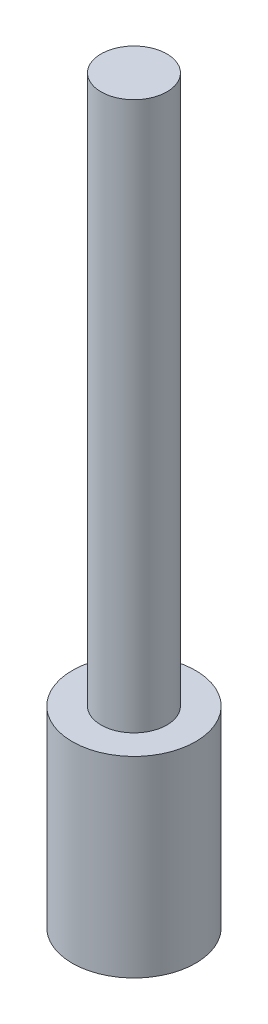
ISO-10303-21;
HEADER;
FILE_DESCRIPTION(('STEP AP214'),'2;1');
FILE_NAME('part.step','',(''),(''),'','','');
FILE_SCHEMA(('AUTOMOTIVE_DESIGN { 1 0 10303 214 1 1 1 1 }'));
ENDSEC;
DATA;
#1=APPLICATION_CONTEXT('core data for automotive mechanical design processes');
#2=APPLICATION_PROTOCOL_DEFINITION('international standard','automotive_design',2000,#1);
#3=PRODUCT_CONTEXT('',#1,'mechanical');
#4=PRODUCT('Part','Part','',(#3));
#5=PRODUCT_RELATED_PRODUCT_CATEGORY('part','',(#4));
#6=PRODUCT_DEFINITION_FORMATION('','',#4);
#7=PRODUCT_DEFINITION_CONTEXT('part definition',#1,'design');
#8=PRODUCT_DEFINITION('design','',#6,#7);
#9=PRODUCT_DEFINITION_SHAPE('','',#8);
#10=(LENGTH_UNIT() NAMED_UNIT(*) SI_UNIT(.MILLI.,.METRE.));
#11=(NAMED_UNIT(*) PLANE_ANGLE_UNIT() SI_UNIT($,.RADIAN.));
#12=(NAMED_UNIT(*) SI_UNIT($,.STERADIAN.) SOLID_ANGLE_UNIT());
#13=UNCERTAINTY_MEASURE_WITH_UNIT(LENGTH_MEASURE(1.E-05),#10,'distance_accuracy_value','');
#14=(GEOMETRIC_REPRESENTATION_CONTEXT(3) GLOBAL_UNCERTAINTY_ASSIGNED_CONTEXT((#13)) GLOBAL_UNIT_ASSIGNED_CONTEXT((#10,
#11,#12)) REPRESENTATION_CONTEXT('',''));
#15=CARTESIAN_POINT('',(0.,0.,0.));
#16=DIRECTION('',(0.,0.,1.));
#17=DIRECTION('',(1.,0.,0.));
#18=AXIS2_PLACEMENT_3D('',#15,#16,#17);
#19=CARTESIAN_POINT('',(0.,14.,0.));
#20=DIRECTION('',(0.,-1.,0.));
#21=DIRECTION('',(0.,0.,-1.));
#22=AXIS2_PLACEMENT_3D('',#19,#20,#21);
#23=CYLINDRICAL_SURFACE('',#22,4.5);
#24=CARTESIAN_POINT('',(0.,14.,0.));
#25=DIRECTION('',(0.,1.,0.));
#26=DIRECTION('',(0.,0.,1.));
#27=AXIS2_PLACEMENT_3D('',#24,#25,#26);
#28=CIRCLE('',#27,4.5);
#29=CARTESIAN_POINT('',(0.,14.,4.5));
#30=VERTEX_POINT('',#29);
#31=EDGE_CURVE('E48',#30,#30,#28,.T.);
#32=ORIENTED_EDGE('',*,*,#31,.F.);
#33=EDGE_LOOP('',(#32));
#34=FACE_BOUND('',#33,.T.);
#35=CARTESIAN_POINT('',(0.,0.,0.));
#36=DIRECTION('',(0.,1.,0.));
#37=DIRECTION('',(0.,0.,1.));
#38=AXIS2_PLACEMENT_3D('',#35,#36,#37);
#39=CIRCLE('',#38,4.5);
#40=CARTESIAN_POINT('',(0.,0.,4.5));
#41=VERTEX_POINT('',#40);
#42=EDGE_CURVE('E42',#41,#41,#39,.T.);
#43=ORIENTED_EDGE('',*,*,#42,.T.);
#44=EDGE_LOOP('',(#43));
#45=FACE_BOUND('',#44,.T.);
#46=ADVANCED_FACE('F39',(#34,#45),#23,.T.);
#47=CARTESIAN_POINT('',(0.,14.,0.));
#48=DIRECTION('',(0.,1.,0.));
#49=DIRECTION('',(0.,0.,1.));
#50=AXIS2_PLACEMENT_3D('',#47,#48,#49);
#51=PLANE('',#50);
#52=CARTESIAN_POINT('',(0.,14.,0.));
#53=DIRECTION('',(0.,1.,0.));
#54=DIRECTION('',(0.,0.,1.));
#55=AXIS2_PLACEMENT_3D('',#52,#53,#54);
#56=CIRCLE('',#55,2.4);
#57=CARTESIAN_POINT('',(0.,14.,2.4));
#58=VERTEX_POINT('',#57);
#59=EDGE_CURVE('E11',#58,#58,#56,.T.);
#60=ORIENTED_EDGE('',*,*,#59,.F.);
#61=EDGE_LOOP('',(#60));
#62=FACE_BOUND('',#61,.T.);
#63=ORIENTED_EDGE('',*,*,#31,.T.);
#64=EDGE_LOOP('',(#63));
#65=FACE_BOUND('',#64,.T.);
#66=ADVANCED_FACE('F103',(#62,#65),#51,.T.);
#67=CARTESIAN_POINT('',(0.,0.,0.));
#68=DIRECTION('',(0.,1.,0.));
#69=DIRECTION('',(0.,0.,1.));
#70=AXIS2_PLACEMENT_3D('',#67,#68,#69);
#71=PLANE('',#70);
#72=CARTESIAN_POINT('',(0.,0.,0.));
#73=DIRECTION('',(0.,-1.,0.));
#74=DIRECTION('',(0.,0.,-1.));
#75=AXIS2_PLACEMENT_3D('',#72,#73,#74);
#76=CIRCLE('',#75,1.5);
#77=CARTESIAN_POINT('',(-1.30139373609257,0.,-0.745905050029179));
#78=VERTEX_POINT('',#77);
#79=CARTESIAN_POINT('',(-0.596687094489993,0.,1.37621383195675));
#80=VERTEX_POINT('',#79);
#81=EDGE_CURVE('E76',#78,#80,#76,.T.);
#82=ORIENTED_EDGE('',*,*,#81,.F.);
#83=DIRECTION('',(-0.315154390963787,0.,-0.94904041529128));
#84=VECTOR('',#83,1.);
#85=CARTESIAN_POINT('',(-0.949040415291279,0.,0.315154390963787));
#86=LINE('',#85,#84);
#87=EDGE_CURVE('E56',#80,#78,#86,.T.);
#88=ORIENTED_EDGE('',*,*,#87,.F.);
#89=EDGE_LOOP('',(#82,#88));
#90=FACE_BOUND('',#89,.T.);
#91=ORIENTED_EDGE('',*,*,#42,.F.);
#92=EDGE_LOOP('',(#91));
#93=FACE_BOUND('',#92,.T.);
#94=ADVANCED_FACE('F81',(#90,#93),#71,.F.);
#95=CARTESIAN_POINT('',(-0.949040415291279,9.,0.315154390963787));
#96=DIRECTION('',(-0.94904041529128,0.,0.315154390963787));
#97=DIRECTION('',(0.315154390963787,0.,0.94904041529128));
#98=AXIS2_PLACEMENT_3D('',#95,#96,#97);
#99=PLANE('',#98);
#100=ORIENTED_EDGE('',*,*,#87,.T.);
#101=DIRECTION('',(0.,-1.,0.));
#102=VECTOR('',#101,1.);
#103=CARTESIAN_POINT('',(-1.30139373609257,9.,-0.745905050029179));
#104=LINE('',#103,#102);
#105=CARTESIAN_POINT('',(-1.30139373609257,9.,-0.745905050029179));
#106=VERTEX_POINT('',#105);
#107=EDGE_CURVE('E73',#106,#78,#104,.T.);
#108=ORIENTED_EDGE('',*,*,#107,.F.);
#109=DIRECTION('',(-0.315154390963787,0.,-0.94904041529128));
#110=VECTOR('',#109,1.);
#111=CARTESIAN_POINT('',(-0.949040415291279,9.,0.315154390963787));
#112=LINE('',#111,#110);
#113=CARTESIAN_POINT('',(-0.596687094489993,9.,1.37621383195675));
#114=VERTEX_POINT('',#113);
#115=EDGE_CURVE('E70',#114,#106,#112,.T.);
#116=ORIENTED_EDGE('',*,*,#115,.F.);
#117=DIRECTION('',(0.,-1.,0.));
#118=VECTOR('',#117,1.);
#119=CARTESIAN_POINT('',(-0.596687094489993,9.,1.37621383195675));
#120=LINE('',#119,#118);
#121=EDGE_CURVE('E64',#114,#80,#120,.T.);
#122=ORIENTED_EDGE('',*,*,#121,.T.);
#123=EDGE_LOOP('',(#100,#108,#116,#122));
#124=FACE_BOUND('',#123,.T.);
#125=ADVANCED_FACE('F68',(#124),#99,.F.);
#126=CARTESIAN_POINT('',(0.,9.,0.));
#127=DIRECTION('',(0.,-1.,0.));
#128=DIRECTION('',(0.,0.,-1.));
#129=AXIS2_PLACEMENT_3D('',#126,#127,#128);
#130=CYLINDRICAL_SURFACE('',#129,1.5);
#131=ORIENTED_EDGE('',*,*,#81,.T.);
#132=ORIENTED_EDGE('',*,*,#121,.F.);
#133=CARTESIAN_POINT('',(0.,9.,0.));
#134=DIRECTION('',(0.,-1.,0.));
#135=DIRECTION('',(0.,0.,-1.));
#136=AXIS2_PLACEMENT_3D('',#133,#134,#135);
#137=CIRCLE('',#136,1.5);
#138=EDGE_CURVE('E90',#106,#114,#137,.T.);
#139=ORIENTED_EDGE('',*,*,#138,.F.);
#140=ORIENTED_EDGE('',*,*,#107,.T.);
#141=EDGE_LOOP('',(#131,#132,#139,#140));
#142=FACE_BOUND('',#141,.T.);
#143=ADVANCED_FACE('F77',(#142),#130,.F.);
#144=CARTESIAN_POINT('',(0.,9.,0.));
#145=DIRECTION('',(0.,-1.,0.));
#146=DIRECTION('',(0.,0.,-1.));
#147=AXIS2_PLACEMENT_3D('',#144,#145,#146);
#148=PLANE('',#147);
#149=ORIENTED_EDGE('',*,*,#115,.T.);
#150=ORIENTED_EDGE('',*,*,#138,.T.);
#151=EDGE_LOOP('',(#149,#150));
#152=FACE_BOUND('',#151,.T.);
#153=ADVANCED_FACE('F126',(#152),#148,.T.);
#154=CARTESIAN_POINT('',(0.,54.,0.));
#155=DIRECTION('',(0.,-1.,0.));
#156=DIRECTION('',(0.,0.,-1.));
#157=AXIS2_PLACEMENT_3D('',#154,#155,#156);
#158=CYLINDRICAL_SURFACE('',#157,2.4);
#159=CARTESIAN_POINT('',(0.,54.,0.));
#160=DIRECTION('',(0.,1.,0.));
#161=DIRECTION('',(0.,0.,1.));
#162=AXIS2_PLACEMENT_3D('',#159,#160,#161);
#163=CIRCLE('',#162,2.4);
#164=CARTESIAN_POINT('',(0.,54.,2.4));
#165=VERTEX_POINT('',#164);
#166=EDGE_CURVE('E84',#165,#165,#163,.T.);
#167=ORIENTED_EDGE('',*,*,#166,.F.);
#168=EDGE_LOOP('',(#167));
#169=FACE_BOUND('',#168,.T.);
#170=ORIENTED_EDGE('',*,*,#59,.T.);
#171=EDGE_LOOP('',(#170));
#172=FACE_BOUND('',#171,.T.);
#173=ADVANCED_FACE('F131',(#169,#172),#158,.T.);
#174=CARTESIAN_POINT('',(0.,54.,0.));
#175=DIRECTION('',(0.,1.,0.));
#176=DIRECTION('',(0.,0.,1.));
#177=AXIS2_PLACEMENT_3D('',#174,#175,#176);
#178=PLANE('',#177);
#179=ORIENTED_EDGE('',*,*,#166,.T.);
#180=EDGE_LOOP('',(#179));
#181=FACE_BOUND('',#180,.T.);
#182=ADVANCED_FACE('F136',(#181),#178,.T.);
#183=CLOSED_SHELL('',(#46,#66,#94,#125,#143,#153,#173,#182));
#184=MANIFOLD_SOLID_BREP('B2',#183);
#185=ADVANCED_BREP_SHAPE_REPRESENTATION('',(#18,#184),#14);
#186=SHAPE_DEFINITION_REPRESENTATION(#9,#185);
ENDSEC;
END-ISO-10303-21;
